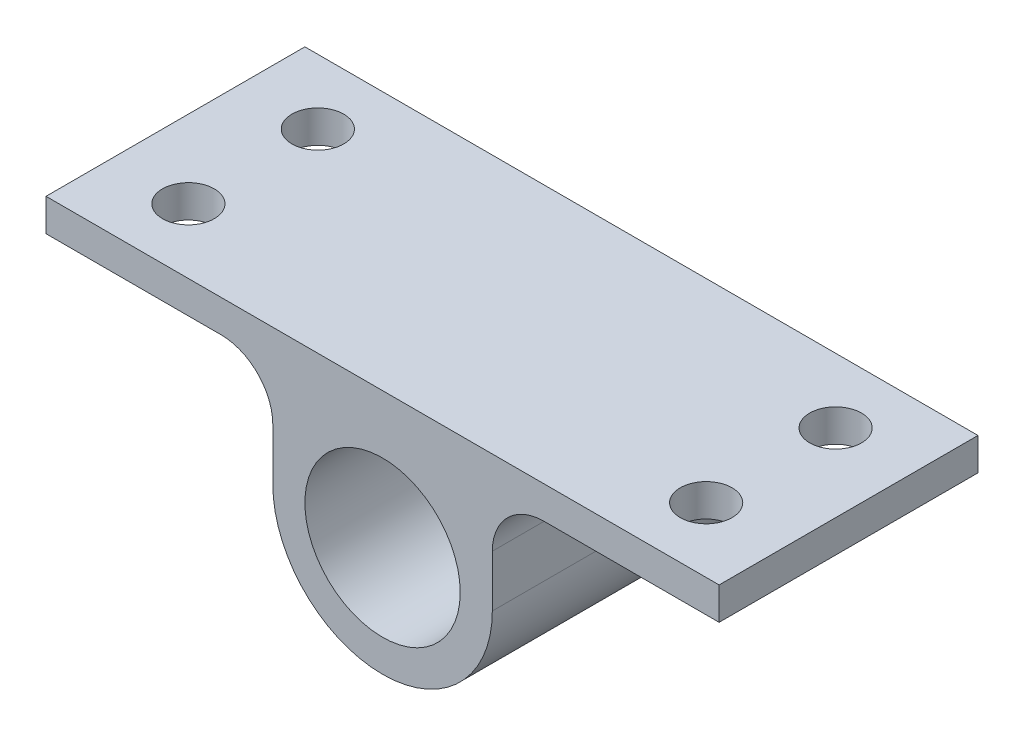
ISO-10303-21;
HEADER;
FILE_DESCRIPTION(('STEP AP214'),'2;1');
FILE_NAME('part.step','',(''),(''),'','','');
FILE_SCHEMA(('AUTOMOTIVE_DESIGN { 1 0 10303 214 1 1 1 1 }'));
ENDSEC;
DATA;
#1=APPLICATION_CONTEXT('core data for automotive mechanical design processes');
#2=APPLICATION_PROTOCOL_DEFINITION('international standard','automotive_design',2000,#1);
#3=PRODUCT_CONTEXT('',#1,'mechanical');
#4=PRODUCT('Part','Part','',(#3));
#5=PRODUCT_RELATED_PRODUCT_CATEGORY('part','',(#4));
#6=PRODUCT_DEFINITION_FORMATION('','',#4);
#7=PRODUCT_DEFINITION_CONTEXT('part definition',#1,'design');
#8=PRODUCT_DEFINITION('design','',#6,#7);
#9=PRODUCT_DEFINITION_SHAPE('','',#8);
#10=(LENGTH_UNIT() NAMED_UNIT(*) SI_UNIT(.MILLI.,.METRE.));
#11=(NAMED_UNIT(*) PLANE_ANGLE_UNIT() SI_UNIT($,.RADIAN.));
#12=(NAMED_UNIT(*) SI_UNIT($,.STERADIAN.) SOLID_ANGLE_UNIT());
#13=UNCERTAINTY_MEASURE_WITH_UNIT(LENGTH_MEASURE(1.E-05),#10,'distance_accuracy_value','');
#14=(GEOMETRIC_REPRESENTATION_CONTEXT(3) GLOBAL_UNCERTAINTY_ASSIGNED_CONTEXT((#13)) GLOBAL_UNIT_ASSIGNED_CONTEXT((#10,
#11,#12)) REPRESENTATION_CONTEXT('',''));
#15=CARTESIAN_POINT('',(0.,0.,0.));
#16=DIRECTION('',(0.,0.,1.));
#17=DIRECTION('',(1.,0.,0.));
#18=AXIS2_PLACEMENT_3D('',#15,#16,#17);
#19=CARTESIAN_POINT('',(-63.7740534775217,-6.26889189781904,31.7499999999997));
#20=DIRECTION('',(0.,0.,1.));
#21=DIRECTION('',(1.,0.,0.));
#22=AXIS2_PLACEMENT_3D('',#19,#20,#21);
#23=PLANE('',#22);
#24=DIRECTION('',(0.,-1.00000000000002,0.));
#25=VECTOR('',#24,1.);
#26=CARTESIAN_POINT('',(-106.700053477522,14.3813081021827,31.7499999999995));
#27=LINE('',#26,#25);
#28=CARTESIAN_POINT('',(-106.700053477522,14.3813081021827,31.7499999999995));
#29=VERTEX_POINT('',#28);
#30=CARTESIAN_POINT('',(-106.700053477522,6.43110810218028,31.7499999999995));
#31=VERTEX_POINT('',#30);
#32=EDGE_CURVE('E174',#29,#31,#27,.T.);
#33=ORIENTED_EDGE('',*,*,#32,.T.);
#34=DIRECTION('',(1.,0.,0.));
#35=VECTOR('',#34,1.);
#36=CARTESIAN_POINT('',(-106.700053477522,6.43110810218028,31.7499999999995));
#37=LINE('',#36,#35);
#38=CARTESIAN_POINT('',(-63.7740534775215,6.43110810218028,31.7499999999997));
#39=VERTEX_POINT('',#38);
#40=EDGE_CURVE('E112',#31,#39,#37,.T.);
#41=ORIENTED_EDGE('',*,*,#40,.T.);
#42=CARTESIAN_POINT('',(-63.7740534775217,-6.26889189781904,31.7499999999997));
#43=DIRECTION('',(0.,0.,-1.));
#44=DIRECTION('',(1.,0.,0.));
#45=AXIS2_PLACEMENT_3D('',#42,#43,#44);
#46=CIRCLE('',#45,12.7);
#47=CARTESIAN_POINT('',(-51.0740534775214,-6.26889189781976,31.7499999999998));
#48=VERTEX_POINT('',#47);
#49=EDGE_CURVE('E195',#39,#48,#46,.T.);
#50=ORIENTED_EDGE('',*,*,#49,.T.);
#51=DIRECTION('',(0.,-1.00000000000001,0.));
#52=VECTOR('',#51,1.);
#53=CARTESIAN_POINT('',(-51.0740534775216,-18.9688918978196,31.7499999999998));
#54=LINE('',#53,#52);
#55=CARTESIAN_POINT('',(-51.0740534775216,-18.9688918978196,31.7499999999998));
#56=VERTEX_POINT('',#55);
#57=EDGE_CURVE('E214',#48,#56,#54,.T.);
#58=ORIENTED_EDGE('',*,*,#57,.T.);
#59=CARTESIAN_POINT('',(-24.1500534775215,-18.9688918978197,31.7499999999998));
#60=DIRECTION('',(0.,0.,1.));
#61=DIRECTION('',(1.,0.,0.));
#62=AXIS2_PLACEMENT_3D('',#59,#60,#61);
#63=CIRCLE('',#62,26.924);
#64=CARTESIAN_POINT('',(2.77394652247842,-18.9688918978196,31.75));
#65=VERTEX_POINT('',#64);
#66=EDGE_CURVE('E211',#56,#65,#63,.T.);
#67=ORIENTED_EDGE('',*,*,#66,.T.);
#68=DIRECTION('',(0.,1.00000000000001,0.));
#69=VECTOR('',#68,1.);
#70=CARTESIAN_POINT('',(2.77394652247842,-18.9688918978196,31.75));
#71=LINE('',#70,#69);
#72=CARTESIAN_POINT('',(2.77394652247857,-6.26889189781854,31.75));
#73=VERTEX_POINT('',#72);
#74=EDGE_CURVE('E213',#65,#73,#71,.T.);
#75=ORIENTED_EDGE('',*,*,#74,.T.);
#76=CARTESIAN_POINT('',(15.4739465224786,-6.26889189781965,31.75));
#77=DIRECTION('',(0.,0.,-1.));
#78=DIRECTION('',(-1.,0.,0.));
#79=AXIS2_PLACEMENT_3D('',#76,#77,#78);
#80=CIRCLE('',#79,12.7);
#81=CARTESIAN_POINT('',(15.4739465224787,6.43110810218028,31.75));
#82=VERTEX_POINT('',#81);
#83=EDGE_CURVE('E137',#73,#82,#80,.T.);
#84=ORIENTED_EDGE('',*,*,#83,.T.);
#85=DIRECTION('',(1.,0.,0.));
#86=VECTOR('',#85,1.);
#87=CARTESIAN_POINT('',(15.4739465224787,6.43110810218028,31.75));
#88=LINE('',#87,#86);
#89=CARTESIAN_POINT('',(58.3999465224786,6.43110810218028,31.7500000000002));
#90=VERTEX_POINT('',#89);
#91=EDGE_CURVE('E131',#82,#90,#88,.T.);
#92=ORIENTED_EDGE('',*,*,#91,.T.);
#93=DIRECTION('',(0.,1.00000000000001,0.));
#94=VECTOR('',#93,1.);
#95=CARTESIAN_POINT('',(58.3999465224787,14.3813081021827,31.7500000000002));
#96=LINE('',#95,#94);
#97=CARTESIAN_POINT('',(58.3999465224787,14.3813081021827,31.7500000000002));
#98=VERTEX_POINT('',#97);
#99=EDGE_CURVE('E135',#90,#98,#96,.T.);
#100=ORIENTED_EDGE('',*,*,#99,.T.);
#101=DIRECTION('',(-1.,0.,0.));
#102=VECTOR('',#101,1.);
#103=CARTESIAN_POINT('',(-106.700053477522,14.3813081021827,31.7499999999995));
#104=LINE('',#103,#102);
#105=EDGE_CURVE('E63',#98,#29,#104,.T.);
#106=ORIENTED_EDGE('',*,*,#105,.T.);
#107=EDGE_LOOP('',(#33,#41,#50,#58,#67,#75,#84,#92,#100,#106));
#108=FACE_BOUND('',#107,.T.);
#109=CARTESIAN_POINT('',(-24.1500534775215,-18.9688918978197,31.7499999999998));
#110=DIRECTION('',(0.,0.,1.));
#111=DIRECTION('',(1.,0.,0.));
#112=AXIS2_PLACEMENT_3D('',#109,#110,#111);
#113=CIRCLE('',#112,19.05);
#114=CARTESIAN_POINT('',(-5.1000534775215,-18.9688918978197,31.7499999999999));
#115=VERTEX_POINT('',#114);
#116=EDGE_CURVE('E159',#115,#115,#113,.T.);
#117=ORIENTED_EDGE('',*,*,#116,.F.);
#118=EDGE_LOOP('',(#117));
#119=FACE_BOUND('',#118,.T.);
#120=ADVANCED_FACE('F46',(#108,#119),#23,.T.);
#121=CARTESIAN_POINT('',(-63.7740534775219,-6.26889189781876,-31.7500000000003));
#122=DIRECTION('',(0.,0.,1.));
#123=DIRECTION('',(1.,0.,0.));
#124=AXIS2_PLACEMENT_3D('',#121,#122,#123);
#125=PLANE('',#124);
#126=DIRECTION('',(0.,-1.00000000000002,0.));
#127=VECTOR('',#126,1.);
#128=CARTESIAN_POINT('',(-106.700053477522,14.3813081021827,-31.7500000000005));
#129=LINE('',#128,#127);
#130=CARTESIAN_POINT('',(-106.700053477522,14.3813081021827,-31.7500000000005));
#131=VERTEX_POINT('',#130);
#132=CARTESIAN_POINT('',(-106.700053477522,6.43110810218028,-31.7500000000005));
#133=VERTEX_POINT('',#132);
#134=EDGE_CURVE('E155',#131,#133,#129,.T.);
#135=ORIENTED_EDGE('',*,*,#134,.F.);
#136=DIRECTION('',(-1.,0.,0.));
#137=VECTOR('',#136,1.);
#138=CARTESIAN_POINT('',(-106.700053477522,14.3813081021827,-31.7500000000005));
#139=LINE('',#138,#137);
#140=CARTESIAN_POINT('',(58.3999465224786,14.3813081021827,-31.7499999999998));
#141=VERTEX_POINT('',#140);
#142=EDGE_CURVE('E104',#141,#131,#139,.T.);
#143=ORIENTED_EDGE('',*,*,#142,.F.);
#144=DIRECTION('',(0.,1.00000000000001,0.));
#145=VECTOR('',#144,1.);
#146=CARTESIAN_POINT('',(58.3999465224786,14.3813081021827,-31.7499999999998));
#147=LINE('',#146,#145);
#148=CARTESIAN_POINT('',(58.3999465224786,6.43110810218028,-31.7499999999998));
#149=VERTEX_POINT('',#148);
#150=EDGE_CURVE('E98',#149,#141,#147,.T.);
#151=ORIENTED_EDGE('',*,*,#150,.F.);
#152=DIRECTION('',(1.,0.,0.));
#153=VECTOR('',#152,1.);
#154=CARTESIAN_POINT('',(15.4739465224784,6.43110810218028,-31.75));
#155=LINE('',#154,#153);
#156=CARTESIAN_POINT('',(15.4739465224784,6.43110810218028,-31.75));
#157=VERTEX_POINT('',#156);
#158=EDGE_CURVE('E145',#157,#149,#155,.T.);
#159=ORIENTED_EDGE('',*,*,#158,.F.);
#160=CARTESIAN_POINT('',(15.4739465224783,-6.26889189781965,-31.75));
#161=DIRECTION('',(0.,0.,-1.));
#162=DIRECTION('',(-1.,0.,0.));
#163=AXIS2_PLACEMENT_3D('',#160,#161,#162);
#164=CIRCLE('',#163,12.7);
#165=CARTESIAN_POINT('',(2.77394652247834,-6.26889189781871,-31.75));
#166=VERTEX_POINT('',#165);
#167=EDGE_CURVE('E169',#166,#157,#164,.T.);
#168=ORIENTED_EDGE('',*,*,#167,.F.);
#169=DIRECTION('',(0.,1.00000000000001,0.));
#170=VECTOR('',#169,1.);
#171=CARTESIAN_POINT('',(2.77394652247827,-18.9688918978196,-31.75));
#172=LINE('',#171,#170);
#173=CARTESIAN_POINT('',(2.77394652247827,-18.9688918978196,-31.75));
#174=VERTEX_POINT('',#173);
#175=EDGE_CURVE('E167',#174,#166,#172,.T.);
#176=ORIENTED_EDGE('',*,*,#175,.F.);
#177=CARTESIAN_POINT('',(-24.1500534775217,-18.9688918978195,-31.7500000000002));
#178=DIRECTION('',(0.,0.,1.));
#179=DIRECTION('',(1.,0.,0.));
#180=AXIS2_PLACEMENT_3D('',#177,#178,#179);
#181=CIRCLE('',#180,26.924);
#182=CARTESIAN_POINT('',(-51.0740534775217,-18.9688918978196,-31.7500000000002));
#183=VERTEX_POINT('',#182);
#184=EDGE_CURVE('E165',#183,#174,#181,.T.);
#185=ORIENTED_EDGE('',*,*,#184,.F.);
#186=DIRECTION('',(0.,-1.00000000000001,0.));
#187=VECTOR('',#186,1.);
#188=CARTESIAN_POINT('',(-51.0740534775217,-18.9688918978196,-31.7500000000002));
#189=LINE('',#188,#187);
#190=CARTESIAN_POINT('',(-51.0740534775218,-6.26889189781915,-31.7500000000002));
#191=VERTEX_POINT('',#190);
#192=EDGE_CURVE('E163',#191,#183,#189,.T.);
#193=ORIENTED_EDGE('',*,*,#192,.F.);
#194=CARTESIAN_POINT('',(-63.7740534775219,-6.26889189781876,-31.7500000000003));
#195=DIRECTION('',(0.,0.,-1.));
#196=DIRECTION('',(1.,0.,0.));
#197=AXIS2_PLACEMENT_3D('',#194,#195,#196);
#198=CIRCLE('',#197,12.7);
#199=CARTESIAN_POINT('',(-63.7740534775218,6.43110810218028,-31.7500000000003));
#200=VERTEX_POINT('',#199);
#201=EDGE_CURVE('E161',#200,#191,#198,.T.);
#202=ORIENTED_EDGE('',*,*,#201,.F.);
#203=DIRECTION('',(1.,0.,0.));
#204=VECTOR('',#203,1.);
#205=CARTESIAN_POINT('',(-106.700053477522,6.43110810218028,-31.7500000000005));
#206=LINE('',#205,#204);
#207=EDGE_CURVE('E158',#133,#200,#206,.T.);
#208=ORIENTED_EDGE('',*,*,#207,.F.);
#209=EDGE_LOOP('',(#135,#143,#151,#159,#168,#176,#185,#193,#202,#208));
#210=FACE_BOUND('',#209,.T.);
#211=CARTESIAN_POINT('',(-24.1500534775217,-18.9688918978195,-31.7500000000002));
#212=DIRECTION('',(0.,0.,1.));
#213=DIRECTION('',(1.,0.,0.));
#214=AXIS2_PLACEMENT_3D('',#211,#212,#213);
#215=CIRCLE('',#214,19.05);
#216=CARTESIAN_POINT('',(-5.10005347752174,-18.9688918978195,-31.7500000000001));
#217=VERTEX_POINT('',#216);
#218=EDGE_CURVE('E222',#217,#217,#215,.T.);
#219=ORIENTED_EDGE('',*,*,#218,.T.);
#220=EDGE_LOOP('',(#219));
#221=FACE_BOUND('',#220,.T.);
#222=ADVANCED_FACE('F199',(#210,#221),#125,.F.);
#223=CARTESIAN_POINT('',(-106.700053477522,14.3813081021827,31.7499999999995));
#224=DIRECTION('',(1.,0.,0.));
#225=DIRECTION('',(0.,1.00000000000002,0.));
#226=AXIS2_PLACEMENT_3D('',#223,#224,#225);
#227=PLANE('',#226);
#228=ORIENTED_EDGE('',*,*,#134,.T.);
#229=DIRECTION('',(0.,0.,-1.));
#230=VECTOR('',#229,1.);
#231=CARTESIAN_POINT('',(-106.700053477522,6.43110810218028,31.7499999999995));
#232=LINE('',#231,#230);
#233=EDGE_CURVE('E13',#31,#133,#232,.T.);
#234=ORIENTED_EDGE('',*,*,#233,.F.);
#235=ORIENTED_EDGE('',*,*,#32,.F.);
#236=DIRECTION('',(0.,0.,-1.));
#237=VECTOR('',#236,1.);
#238=CARTESIAN_POINT('',(-106.700053477522,14.3813081021827,31.7499999999995));
#239=LINE('',#238,#237);
#240=EDGE_CURVE('E151',#29,#131,#239,.T.);
#241=ORIENTED_EDGE('',*,*,#240,.T.);
#242=EDGE_LOOP('',(#228,#234,#235,#241));
#243=FACE_BOUND('',#242,.T.);
#244=ADVANCED_FACE('F48',(#243),#227,.F.);
#245=CARTESIAN_POINT('',(-106.700053477522,6.43110810218028,31.7499999999995));
#246=DIRECTION('',(0.,1.00000000000001,0.));
#247=DIRECTION('',(0.,0.,1.));
#248=AXIS2_PLACEMENT_3D('',#245,#246,#247);
#249=PLANE('',#248);
#250=CARTESIAN_POINT('',(-87.650053477522,6.43110810218084,-15.8750000000003));
#251=DIRECTION('',(0.,1.00000000000001,0.));
#252=DIRECTION('',(0.,0.,1.));
#253=AXIS2_PLACEMENT_3D('',#250,#251,#252);
#254=CIRCLE('',#253,6.35);
#255=CARTESIAN_POINT('',(-87.650053477522,6.43110810218084,-9.52500000000031));
#256=VERTEX_POINT('',#255);
#257=EDGE_CURVE('E233',#256,#256,#254,.T.);
#258=ORIENTED_EDGE('',*,*,#257,.T.);
#259=EDGE_LOOP('',(#258));
#260=FACE_BOUND('',#259,.T.);
#261=CARTESIAN_POINT('',(-87.6500534775219,6.43110810218128,15.8749999999997));
#262=DIRECTION('',(0.,1.00000000000001,0.));
#263=DIRECTION('',(0.,0.,1.));
#264=AXIS2_PLACEMENT_3D('',#261,#262,#263);
#265=CIRCLE('',#264,6.35);
#266=CARTESIAN_POINT('',(-87.6500534775218,6.43110810218128,22.2249999999997));
#267=VERTEX_POINT('',#266);
#268=EDGE_CURVE('E236',#267,#267,#265,.T.);
#269=ORIENTED_EDGE('',*,*,#268,.T.);
#270=EDGE_LOOP('',(#269));
#271=FACE_BOUND('',#270,.T.);
#272=ORIENTED_EDGE('',*,*,#207,.T.);
#273=DIRECTION('',(0.,0.,-1.));
#274=VECTOR('',#273,1.);
#275=CARTESIAN_POINT('',(-63.7740534775215,6.43110810218028,31.7499999999997));
#276=LINE('',#275,#274);
#277=EDGE_CURVE('E55',#39,#200,#276,.T.);
#278=ORIENTED_EDGE('',*,*,#277,.F.);
#279=ORIENTED_EDGE('',*,*,#40,.F.);
#280=ORIENTED_EDGE('',*,*,#233,.T.);
#281=EDGE_LOOP('',(#272,#278,#279,#280));
#282=FACE_BOUND('',#281,.T.);
#283=ADVANCED_FACE('F269',(#260,#271,#282),#249,.F.);
#284=CARTESIAN_POINT('',(-63.7740534775217,-6.26889189781904,31.7499999999997));
#285=DIRECTION('',(0.,0.,-1.));
#286=DIRECTION('',(-1.,0.,0.));
#287=AXIS2_PLACEMENT_3D('',#284,#285,#286);
#288=CYLINDRICAL_SURFACE('',#287,12.7);
#289=ORIENTED_EDGE('',*,*,#201,.T.);
#290=DIRECTION('',(0.,0.,-1.));
#291=VECTOR('',#290,1.);
#292=CARTESIAN_POINT('',(-51.0740534775214,-6.26889189781976,31.7499999999998));
#293=LINE('',#292,#291);
#294=EDGE_CURVE('E187',#48,#191,#293,.T.);
#295=ORIENTED_EDGE('',*,*,#294,.F.);
#296=ORIENTED_EDGE('',*,*,#49,.F.);
#297=ORIENTED_EDGE('',*,*,#277,.T.);
#298=EDGE_LOOP('',(#289,#295,#296,#297));
#299=FACE_BOUND('',#298,.T.);
#300=ADVANCED_FACE('F193',(#299),#288,.F.);
#301=CARTESIAN_POINT('',(-51.0740534775216,-18.9688918978196,31.7499999999998));
#302=DIRECTION('',(1.,0.,0.));
#303=DIRECTION('',(0.,0.,-1.));
#304=AXIS2_PLACEMENT_3D('',#301,#302,#303);
#305=PLANE('',#304);
#306=ORIENTED_EDGE('',*,*,#192,.T.);
#307=DIRECTION('',(0.,0.,-1.));
#308=VECTOR('',#307,1.);
#309=CARTESIAN_POINT('',(-51.0740534775216,-18.9688918978196,31.7499999999998));
#310=LINE('',#309,#308);
#311=EDGE_CURVE('E184',#56,#183,#310,.T.);
#312=ORIENTED_EDGE('',*,*,#311,.F.);
#313=ORIENTED_EDGE('',*,*,#57,.F.);
#314=ORIENTED_EDGE('',*,*,#294,.T.);
#315=EDGE_LOOP('',(#306,#312,#313,#314));
#316=FACE_BOUND('',#315,.T.);
#317=ADVANCED_FACE('F205',(#316),#305,.F.);
#318=CARTESIAN_POINT('',(-24.1500534775215,-18.9688918978197,31.7499999999998));
#319=DIRECTION('',(0.,0.,-1.));
#320=DIRECTION('',(-1.,0.,0.));
#321=AXIS2_PLACEMENT_3D('',#318,#319,#320);
#322=CYLINDRICAL_SURFACE('',#321,26.924);
#323=ORIENTED_EDGE('',*,*,#184,.T.);
#324=DIRECTION('',(0.,0.,-1.));
#325=VECTOR('',#324,1.);
#326=CARTESIAN_POINT('',(2.77394652247842,-18.9688918978196,31.75));
#327=LINE('',#326,#325);
#328=EDGE_CURVE('E181',#65,#174,#327,.T.);
#329=ORIENTED_EDGE('',*,*,#328,.F.);
#330=ORIENTED_EDGE('',*,*,#66,.F.);
#331=ORIENTED_EDGE('',*,*,#311,.T.);
#332=EDGE_LOOP('',(#323,#329,#330,#331));
#333=FACE_BOUND('',#332,.T.);
#334=ADVANCED_FACE('F209',(#333),#322,.T.);
#335=CARTESIAN_POINT('',(2.77394652247842,-18.9688918978196,31.75));
#336=DIRECTION('',(-1.,0.,0.));
#337=DIRECTION('',(0.,-1.00000000000001,0.));
#338=AXIS2_PLACEMENT_3D('',#335,#336,#337);
#339=PLANE('',#338);
#340=ORIENTED_EDGE('',*,*,#175,.T.);
#341=DIRECTION('',(0.,0.,-1.));
#342=VECTOR('',#341,1.);
#343=CARTESIAN_POINT('',(2.77394652247857,-6.26889189781854,31.75));
#344=LINE('',#343,#342);
#345=EDGE_CURVE('E178',#73,#166,#344,.T.);
#346=ORIENTED_EDGE('',*,*,#345,.F.);
#347=ORIENTED_EDGE('',*,*,#74,.F.);
#348=ORIENTED_EDGE('',*,*,#328,.T.);
#349=EDGE_LOOP('',(#340,#346,#347,#348));
#350=FACE_BOUND('',#349,.T.);
#351=ADVANCED_FACE('F280',(#350),#339,.F.);
#352=CARTESIAN_POINT('',(15.4739465224786,-6.26889189781965,31.75));
#353=DIRECTION('',(0.,0.,-1.));
#354=DIRECTION('',(-1.,0.,0.));
#355=AXIS2_PLACEMENT_3D('',#352,#353,#354);
#356=CYLINDRICAL_SURFACE('',#355,12.7);
#357=ORIENTED_EDGE('',*,*,#167,.T.);
#358=DIRECTION('',(0.,0.,-1.));
#359=VECTOR('',#358,1.);
#360=CARTESIAN_POINT('',(15.4739465224787,6.43110810218028,31.75));
#361=LINE('',#360,#359);
#362=EDGE_CURVE('E146',#82,#157,#361,.T.);
#363=ORIENTED_EDGE('',*,*,#362,.F.);
#364=ORIENTED_EDGE('',*,*,#83,.F.);
#365=ORIENTED_EDGE('',*,*,#345,.T.);
#366=EDGE_LOOP('',(#357,#363,#364,#365));
#367=FACE_BOUND('',#366,.T.);
#368=ADVANCED_FACE('F277',(#367),#356,.F.);
#369=CARTESIAN_POINT('',(15.4739465224787,6.43110810218028,31.75));
#370=DIRECTION('',(0.,1.00000000000001,0.));
#371=DIRECTION('',(0.,0.,1.));
#372=AXIS2_PLACEMENT_3D('',#369,#370,#371);
#373=PLANE('',#372);
#374=CARTESIAN_POINT('',(39.3499465224786,6.43110810218039,15.8750000000002));
#375=DIRECTION('',(0.,1.00000000000001,0.));
#376=DIRECTION('',(0.,0.,1.));
#377=AXIS2_PLACEMENT_3D('',#374,#375,#376);
#378=CIRCLE('',#377,6.35);
#379=CARTESIAN_POINT('',(39.3499465224786,6.4311081021804,22.2250000000002));
#380=VERTEX_POINT('',#379);
#381=EDGE_CURVE('E225',#380,#380,#378,.T.);
#382=ORIENTED_EDGE('',*,*,#381,.T.);
#383=EDGE_LOOP('',(#382));
#384=FACE_BOUND('',#383,.T.);
#385=CARTESIAN_POINT('',(39.3499465224786,6.43110810218039,-15.8749999999998));
#386=DIRECTION('',(0.,1.00000000000001,0.));
#387=DIRECTION('',(0.,0.,1.));
#388=AXIS2_PLACEMENT_3D('',#385,#386,#387);
#389=CIRCLE('',#388,6.35);
#390=CARTESIAN_POINT('',(39.3499465224786,6.4311081021804,-9.52499999999985));
#391=VERTEX_POINT('',#390);
#392=EDGE_CURVE('E230',#391,#391,#389,.T.);
#393=ORIENTED_EDGE('',*,*,#392,.T.);
#394=EDGE_LOOP('',(#393));
#395=FACE_BOUND('',#394,.T.);
#396=ORIENTED_EDGE('',*,*,#158,.T.);
#397=DIRECTION('',(0.,0.,-1.));
#398=VECTOR('',#397,1.);
#399=CARTESIAN_POINT('',(58.3999465224786,6.43110810218028,31.7500000000002));
#400=LINE('',#399,#398);
#401=EDGE_CURVE('E142',#90,#149,#400,.T.);
#402=ORIENTED_EDGE('',*,*,#401,.F.);
#403=ORIENTED_EDGE('',*,*,#91,.F.);
#404=ORIENTED_EDGE('',*,*,#362,.T.);
#405=EDGE_LOOP('',(#396,#402,#403,#404));
#406=FACE_BOUND('',#405,.T.);
#407=ADVANCED_FACE('F143',(#384,#395,#406),#373,.F.);
#408=CARTESIAN_POINT('',(58.3999465224787,14.3813081021827,31.7500000000002));
#409=DIRECTION('',(-1.,0.,0.));
#410=DIRECTION('',(0.,0.,1.));
#411=AXIS2_PLACEMENT_3D('',#408,#409,#410);
#412=PLANE('',#411);
#413=ORIENTED_EDGE('',*,*,#150,.T.);
#414=DIRECTION('',(0.,0.,-1.));
#415=VECTOR('',#414,1.);
#416=CARTESIAN_POINT('',(58.3999465224787,14.3813081021827,31.7500000000002));
#417=LINE('',#416,#415);
#418=EDGE_CURVE('E147',#98,#141,#417,.T.);
#419=ORIENTED_EDGE('',*,*,#418,.F.);
#420=ORIENTED_EDGE('',*,*,#99,.F.);
#421=ORIENTED_EDGE('',*,*,#401,.T.);
#422=EDGE_LOOP('',(#413,#419,#420,#421));
#423=FACE_BOUND('',#422,.T.);
#424=ADVANCED_FACE('F149',(#423),#412,.F.);
#425=CARTESIAN_POINT('',(-106.700053477522,14.3813081021827,31.7499999999995));
#426=DIRECTION('',(0.,-1.00000000000001,0.));
#427=DIRECTION('',(0.,0.,-1.));
#428=AXIS2_PLACEMENT_3D('',#425,#426,#427);
#429=PLANE('',#428);
#430=CARTESIAN_POINT('',(39.3499465224783,14.3813081021803,15.8750000000002));
#431=DIRECTION('',(0.,1.00000000000001,0.));
#432=DIRECTION('',(0.,0.,1.));
#433=AXIS2_PLACEMENT_3D('',#430,#431,#432);
#434=CIRCLE('',#433,6.35);
#435=CARTESIAN_POINT('',(39.3499465224783,14.3813081021803,22.2250000000002));
#436=VERTEX_POINT('',#435);
#437=EDGE_CURVE('E243',#436,#436,#434,.T.);
#438=ORIENTED_EDGE('',*,*,#437,.F.);
#439=EDGE_LOOP('',(#438));
#440=FACE_BOUND('',#439,.T.);
#441=CARTESIAN_POINT('',(39.3499465224783,14.3813081021803,-15.8749999999998));
#442=DIRECTION('',(0.,1.00000000000001,0.));
#443=DIRECTION('',(0.,0.,1.));
#444=AXIS2_PLACEMENT_3D('',#441,#442,#443);
#445=CIRCLE('',#444,6.35);
#446=CARTESIAN_POINT('',(39.3499465224783,14.3813081021803,-9.52499999999985));
#447=VERTEX_POINT('',#446);
#448=EDGE_CURVE('E246',#447,#447,#445,.T.);
#449=ORIENTED_EDGE('',*,*,#448,.F.);
#450=EDGE_LOOP('',(#449));
#451=FACE_BOUND('',#450,.T.);
#452=CARTESIAN_POINT('',(-87.6500534775221,14.3813081021803,-15.8750000000003));
#453=DIRECTION('',(0.,1.00000000000001,0.));
#454=DIRECTION('',(0.,0.,1.));
#455=AXIS2_PLACEMENT_3D('',#452,#453,#454);
#456=CIRCLE('',#455,6.35);
#457=CARTESIAN_POINT('',(-87.650053477522,14.3813081021803,-9.52500000000031));
#458=VERTEX_POINT('',#457);
#459=EDGE_CURVE('E242',#458,#458,#456,.T.);
#460=ORIENTED_EDGE('',*,*,#459,.F.);
#461=EDGE_LOOP('',(#460));
#462=FACE_BOUND('',#461,.T.);
#463=CARTESIAN_POINT('',(-87.6500534775221,14.3813081021803,15.8749999999997));
#464=DIRECTION('',(0.,1.00000000000001,0.));
#465=DIRECTION('',(0.,0.,1.));
#466=AXIS2_PLACEMENT_3D('',#463,#464,#465);
#467=CIRCLE('',#466,6.35);
#468=CARTESIAN_POINT('',(-87.650053477522,14.3813081021803,22.2249999999997));
#469=VERTEX_POINT('',#468);
#470=EDGE_CURVE('E239',#469,#469,#467,.T.);
#471=ORIENTED_EDGE('',*,*,#470,.F.);
#472=EDGE_LOOP('',(#471));
#473=FACE_BOUND('',#472,.T.);
#474=ORIENTED_EDGE('',*,*,#142,.T.);
#475=ORIENTED_EDGE('',*,*,#240,.F.);
#476=ORIENTED_EDGE('',*,*,#105,.F.);
#477=ORIENTED_EDGE('',*,*,#418,.T.);
#478=EDGE_LOOP('',(#474,#475,#476,#477));
#479=FACE_BOUND('',#478,.T.);
#480=ADVANCED_FACE('F255',(#440,#451,#462,#473,#479),#429,.F.);
#481=CARTESIAN_POINT('',(-24.1500534775215,-18.9688918978197,31.7499999999998));
#482=DIRECTION('',(0.,0.,-1.));
#483=DIRECTION('',(-1.,0.,0.));
#484=AXIS2_PLACEMENT_3D('',#481,#482,#483);
#485=CYLINDRICAL_SURFACE('',#484,19.05);
#486=ORIENTED_EDGE('',*,*,#116,.T.);
#487=EDGE_LOOP('',(#486));
#488=FACE_BOUND('',#487,.T.);
#489=ORIENTED_EDGE('',*,*,#218,.F.);
#490=EDGE_LOOP('',(#489));
#491=FACE_BOUND('',#490,.T.);
#492=ADVANCED_FACE('F258',(#488,#491),#485,.F.);
#493=CARTESIAN_POINT('',(-87.6500534775219,-45.8928918978205,15.8749999999997));
#494=DIRECTION('',(0.,1.00000000000001,0.));
#495=DIRECTION('',(0.,0.,1.));
#496=AXIS2_PLACEMENT_3D('',#493,#494,#495);
#497=CYLINDRICAL_SURFACE('',#496,6.35);
#498=ORIENTED_EDGE('',*,*,#470,.T.);
#499=EDGE_LOOP('',(#498));
#500=FACE_BOUND('',#499,.T.);
#501=ORIENTED_EDGE('',*,*,#268,.F.);
#502=EDGE_LOOP('',(#501));
#503=FACE_BOUND('',#502,.T.);
#504=ADVANCED_FACE('F263',(#500,#503),#497,.F.);
#505=CARTESIAN_POINT('',(-87.6500534775219,-45.8928918978203,-15.8750000000003));
#506=DIRECTION('',(0.,1.00000000000001,0.));
#507=DIRECTION('',(0.,0.,1.));
#508=AXIS2_PLACEMENT_3D('',#505,#506,#507);
#509=CYLINDRICAL_SURFACE('',#508,6.35);
#510=ORIENTED_EDGE('',*,*,#459,.T.);
#511=EDGE_LOOP('',(#510));
#512=FACE_BOUND('',#511,.T.);
#513=ORIENTED_EDGE('',*,*,#257,.F.);
#514=EDGE_LOOP('',(#513));
#515=FACE_BOUND('',#514,.T.);
#516=ADVANCED_FACE('F252',(#512,#515),#509,.F.);
#517=CARTESIAN_POINT('',(39.3499465224785,-45.8928918978209,-15.8749999999998));
#518=DIRECTION('',(0.,1.00000000000001,0.));
#519=DIRECTION('',(0.,0.,1.));
#520=AXIS2_PLACEMENT_3D('',#517,#518,#519);
#521=CYLINDRICAL_SURFACE('',#520,6.35);
#522=ORIENTED_EDGE('',*,*,#448,.T.);
#523=EDGE_LOOP('',(#522));
#524=FACE_BOUND('',#523,.T.);
#525=ORIENTED_EDGE('',*,*,#392,.F.);
#526=EDGE_LOOP('',(#525));
#527=FACE_BOUND('',#526,.T.);
#528=ADVANCED_FACE('F307',(#524,#527),#521,.F.);
#529=CARTESIAN_POINT('',(39.3499465224785,-45.8928918978209,15.8750000000002));
#530=DIRECTION('',(0.,1.00000000000001,0.));
#531=DIRECTION('',(0.,0.,1.));
#532=AXIS2_PLACEMENT_3D('',#529,#530,#531);
#533=CYLINDRICAL_SURFACE('',#532,6.35);
#534=ORIENTED_EDGE('',*,*,#437,.T.);
#535=EDGE_LOOP('',(#534));
#536=FACE_BOUND('',#535,.T.);
#537=ORIENTED_EDGE('',*,*,#381,.F.);
#538=EDGE_LOOP('',(#537));
#539=FACE_BOUND('',#538,.T.);
#540=ADVANCED_FACE('F309',(#536,#539),#533,.F.);
#541=CLOSED_SHELL('',(#120,#222,#244,#283,#300,#317,#334,#351,#368,#407,#424,#480,#492,#504,
#516,#528,#540));
#542=MANIFOLD_SOLID_BREP('B2',#541);
#543=ADVANCED_BREP_SHAPE_REPRESENTATION('',(#18,#542),#14);
#544=SHAPE_DEFINITION_REPRESENTATION(#9,#543);
ENDSEC;
END-ISO-10303-21;
